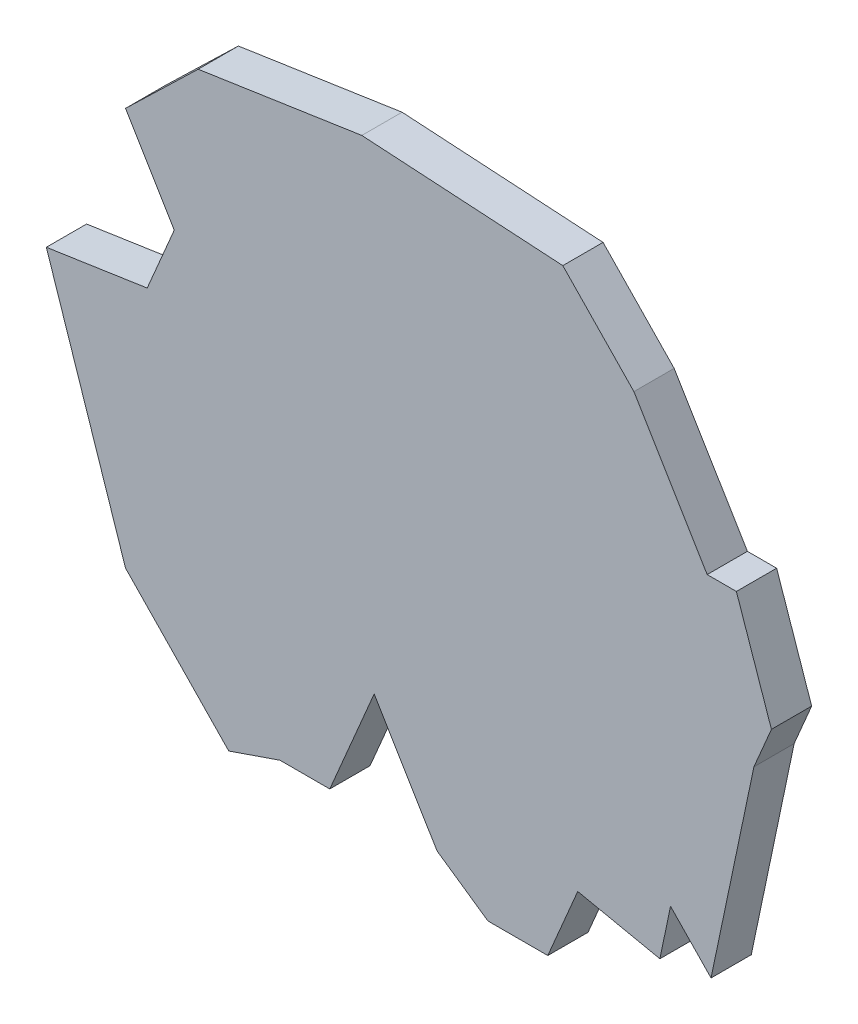
ISO-10303-21;
HEADER;
FILE_DESCRIPTION(('STEP AP214'),'2;1');
FILE_NAME('part.step','',(''),(''),'','','');
FILE_SCHEMA(('AUTOMOTIVE_DESIGN { 1 0 10303 214 1 1 1 1 }'));
ENDSEC;
DATA;
#1=APPLICATION_CONTEXT('core data for automotive mechanical design processes');
#2=APPLICATION_PROTOCOL_DEFINITION('international standard','automotive_design',2000,#1);
#3=PRODUCT_CONTEXT('',#1,'mechanical');
#4=PRODUCT('Part','Part','',(#3));
#5=PRODUCT_RELATED_PRODUCT_CATEGORY('part','',(#4));
#6=PRODUCT_DEFINITION_FORMATION('','',#4);
#7=PRODUCT_DEFINITION_CONTEXT('part definition',#1,'design');
#8=PRODUCT_DEFINITION('design','',#6,#7);
#9=PRODUCT_DEFINITION_SHAPE('','',#8);
#10=(LENGTH_UNIT() NAMED_UNIT(*) SI_UNIT(.MILLI.,.METRE.));
#11=(NAMED_UNIT(*) PLANE_ANGLE_UNIT() SI_UNIT($,.RADIAN.));
#12=(NAMED_UNIT(*) SI_UNIT($,.STERADIAN.) SOLID_ANGLE_UNIT());
#13=UNCERTAINTY_MEASURE_WITH_UNIT(LENGTH_MEASURE(1.E-05),#10,'distance_accuracy_value','');
#14=(GEOMETRIC_REPRESENTATION_CONTEXT(3) GLOBAL_UNCERTAINTY_ASSIGNED_CONTEXT((#13)) GLOBAL_UNIT_ASSIGNED_CONTEXT((#10,
#11,#12)) REPRESENTATION_CONTEXT('',''));
#15=CARTESIAN_POINT('',(0.,0.,0.));
#16=DIRECTION('',(0.,0.,1.));
#17=DIRECTION('',(1.,0.,0.));
#18=AXIS2_PLACEMENT_3D('',#15,#16,#17);
#19=CARTESIAN_POINT('',(-58.6586765581864,-85.7596664690475,10.));
#20=DIRECTION('',(-0.719010466921313,-0.694999243494261,0.));
#21=DIRECTION('',(0.694999243494261,-0.719010466921313,0.));
#22=AXIS2_PLACEMENT_3D('',#19,#20,#21);
#23=PLANE('',#22);
#24=DIRECTION('',(-0.694999243494261,0.719010466921313,0.));
#25=VECTOR('',#24,1.);
#26=CARTESIAN_POINT('',(-58.6586765581864,-85.7596664690475,0.));
#27=LINE('',#26,#25);
#28=CARTESIAN_POINT('',(-58.6586765581864,-85.7596664690475,0.));
#29=VERTEX_POINT('',#28);
#30=CARTESIAN_POINT('',(-84.3143066484571,-59.2176712898566,0.));
#31=VERTEX_POINT('',#30);
#32=EDGE_CURVE('E230',#29,#31,#27,.T.);
#33=ORIENTED_EDGE('',*,*,#32,.F.);
#34=DIRECTION('',(0.,0.,-1.));
#35=VECTOR('',#34,1.);
#36=CARTESIAN_POINT('',(-58.6586765581864,-85.7596664690475,10.));
#37=LINE('',#36,#35);
#38=CARTESIAN_POINT('',(-58.6586765581864,-85.7596664690475,10.));
#39=VERTEX_POINT('',#38);
#40=EDGE_CURVE('E11',#39,#29,#37,.T.);
#41=ORIENTED_EDGE('',*,*,#40,.F.);
#42=DIRECTION('',(-0.694999243494261,0.719010466921313,0.));
#43=VECTOR('',#42,1.);
#44=CARTESIAN_POINT('',(-58.6586765581864,-85.7596664690475,10.));
#45=LINE('',#44,#43);
#46=CARTESIAN_POINT('',(-84.3143066484571,-59.2176712898566,10.));
#47=VERTEX_POINT('',#46);
#48=EDGE_CURVE('E298',#39,#47,#45,.T.);
#49=ORIENTED_EDGE('',*,*,#48,.T.);
#50=DIRECTION('',(0.,0.,-1.));
#51=VECTOR('',#50,1.);
#52=CARTESIAN_POINT('',(-84.3143066484571,-59.2176712898566,10.));
#53=LINE('',#52,#51);
#54=EDGE_CURVE('E40',#47,#31,#53,.T.);
#55=ORIENTED_EDGE('',*,*,#54,.T.);
#56=EDGE_LOOP('',(#33,#41,#49,#55));
#57=FACE_BOUND('',#56,.T.);
#58=ADVANCED_FACE('F37',(#57),#23,.T.);
#59=CARTESIAN_POINT('',(-45.9200094828388,-81.3807496618967,10.));
#60=DIRECTION('',(0.325079768511046,-0.945686599304867,0.));
#61=DIRECTION('',(0.945686599304867,0.325079768511046,0.));
#62=AXIS2_PLACEMENT_3D('',#59,#60,#61);
#63=PLANE('',#62);
#64=DIRECTION('',(-0.945686599304867,-0.325079768511046,0.));
#65=VECTOR('',#64,1.);
#66=CARTESIAN_POINT('',(-45.9200094828388,-81.3807496618967,0.));
#67=LINE('',#66,#65);
#68=CARTESIAN_POINT('',(-45.9200094828388,-81.3807496618967,0.));
#69=VERTEX_POINT('',#68);
#70=EDGE_CURVE('E296',#69,#29,#67,.T.);
#71=ORIENTED_EDGE('',*,*,#70,.F.);
#72=DIRECTION('',(0.,0.,-1.));
#73=VECTOR('',#72,1.);
#74=CARTESIAN_POINT('',(-45.9200094828388,-81.3807496618967,10.));
#75=LINE('',#74,#73);
#76=CARTESIAN_POINT('',(-45.9200094828388,-81.3807496618967,10.));
#77=VERTEX_POINT('',#76);
#78=EDGE_CURVE('E46',#77,#69,#75,.T.);
#79=ORIENTED_EDGE('',*,*,#78,.F.);
#80=DIRECTION('',(-0.945686599304867,-0.325079768511046,0.));
#81=VECTOR('',#80,1.);
#82=CARTESIAN_POINT('',(-45.9200094828388,-81.3807496618967,10.));
#83=LINE('',#82,#81);
#84=EDGE_CURVE('E220',#77,#39,#83,.T.);
#85=ORIENTED_EDGE('',*,*,#84,.T.);
#86=ORIENTED_EDGE('',*,*,#40,.T.);
#87=EDGE_LOOP('',(#71,#79,#85,#86));
#88=FACE_BOUND('',#87,.T.);
#89=ADVANCED_FACE('F343',(#88),#63,.T.);
#90=CARTESIAN_POINT('',(-33.5495131369272,-81.3807496618967,10.));
#91=DIRECTION('',(0.,-1.,0.));
#92=DIRECTION('',(0.,0.,-1.));
#93=AXIS2_PLACEMENT_3D('',#90,#91,#92);
#94=PLANE('',#93);
#95=DIRECTION('',(-1.,0.,0.));
#96=VECTOR('',#95,1.);
#97=CARTESIAN_POINT('',(-33.5495131369272,-81.3807496618967,0.));
#98=LINE('',#97,#96);
#99=CARTESIAN_POINT('',(-33.5495131369272,-81.3807496618967,0.));
#100=VERTEX_POINT('',#99);
#101=EDGE_CURVE('E207',#100,#69,#98,.T.);
#102=ORIENTED_EDGE('',*,*,#101,.F.);
#103=DIRECTION('',(0.,0.,-1.));
#104=VECTOR('',#103,1.);
#105=CARTESIAN_POINT('',(-33.5495131369272,-81.3807496618967,10.));
#106=LINE('',#105,#104);
#107=CARTESIAN_POINT('',(-33.5495131369272,-81.3807496618967,10.));
#108=VERTEX_POINT('',#107);
#109=EDGE_CURVE('E202',#108,#100,#106,.T.);
#110=ORIENTED_EDGE('',*,*,#109,.F.);
#111=DIRECTION('',(-1.,0.,0.));
#112=VECTOR('',#111,1.);
#113=CARTESIAN_POINT('',(-33.5495131369272,-81.3807496618967,10.));
#114=LINE('',#113,#112);
#115=EDGE_CURVE('E205',#108,#77,#114,.T.);
#116=ORIENTED_EDGE('',*,*,#115,.T.);
#117=ORIENTED_EDGE('',*,*,#78,.T.);
#118=EDGE_LOOP('',(#102,#110,#116,#117));
#119=FACE_BOUND('',#118,.T.);
#120=ADVANCED_FACE('F204',(#119),#94,.T.);
#121=CARTESIAN_POINT('',(-22.5126465537247,-55.4116518190673,10.));
#122=DIRECTION('',(0.920330918458475,-0.391140640344852,0.));
#123=DIRECTION('',(0.391140640344852,0.920330918458475,0.));
#124=AXIS2_PLACEMENT_3D('',#121,#122,#123);
#125=PLANE('',#124);
#126=DIRECTION('',(-0.391140640344852,-0.920330918458474,0.));
#127=VECTOR('',#126,1.);
#128=CARTESIAN_POINT('',(-22.5126465537247,-55.4116518190673,0.));
#129=LINE('',#128,#127);
#130=CARTESIAN_POINT('',(-22.5126465537247,-55.4116518190673,0.));
#131=VERTEX_POINT('',#130);
#132=EDGE_CURVE('E293',#131,#100,#129,.T.);
#133=ORIENTED_EDGE('',*,*,#132,.F.);
#134=DIRECTION('',(0.,0.,-1.));
#135=VECTOR('',#134,1.);
#136=CARTESIAN_POINT('',(-22.5126465537247,-55.4116518190673,10.));
#137=LINE('',#136,#135);
#138=CARTESIAN_POINT('',(-22.5126465537247,-55.4116518190673,10.));
#139=VERTEX_POINT('',#138);
#140=EDGE_CURVE('E212',#139,#131,#137,.T.);
#141=ORIENTED_EDGE('',*,*,#140,.F.);
#142=DIRECTION('',(-0.391140640344852,-0.920330918458474,0.));
#143=VECTOR('',#142,1.);
#144=CARTESIAN_POINT('',(-22.5126465537247,-55.4116518190673,10.));
#145=LINE('',#144,#143);
#146=EDGE_CURVE('E218',#139,#108,#145,.T.);
#147=ORIENTED_EDGE('',*,*,#146,.T.);
#148=ORIENTED_EDGE('',*,*,#109,.T.);
#149=EDGE_LOOP('',(#133,#141,#147,#148));
#150=FACE_BOUND('',#149,.T.);
#151=ADVANCED_FACE('F222',(#150),#125,.T.);
#152=CARTESIAN_POINT('',(-6.89506135477158,-81.3807496618967,10.));
#153=DIRECTION('',(-0.856966526830987,-0.51537207131473,0.));
#154=DIRECTION('',(0.51537207131473,-0.856966526830987,0.));
#155=AXIS2_PLACEMENT_3D('',#152,#153,#154);
#156=PLANE('',#155);
#157=DIRECTION('',(-0.51537207131473,0.856966526830987,0.));
#158=VECTOR('',#157,1.);
#159=CARTESIAN_POINT('',(-6.89506135477158,-81.3807496618967,0.));
#160=LINE('',#159,#158);
#161=CARTESIAN_POINT('',(-6.89506135477158,-81.3807496618967,0.));
#162=VERTEX_POINT('',#161);
#163=EDGE_CURVE('E290',#162,#131,#160,.T.);
#164=ORIENTED_EDGE('',*,*,#163,.F.);
#165=DIRECTION('',(0.,0.,-1.));
#166=VECTOR('',#165,1.);
#167=CARTESIAN_POINT('',(-6.89506135477158,-81.3807496618967,10.));
#168=LINE('',#167,#166);
#169=CARTESIAN_POINT('',(-6.89506135477158,-81.3807496618967,10.));
#170=VERTEX_POINT('',#169);
#171=EDGE_CURVE('E302',#170,#162,#168,.T.);
#172=ORIENTED_EDGE('',*,*,#171,.F.);
#173=DIRECTION('',(-0.51537207131473,0.856966526830987,0.));
#174=VECTOR('',#173,1.);
#175=CARTESIAN_POINT('',(-6.89506135477158,-81.3807496618967,10.));
#176=LINE('',#175,#174);
#177=EDGE_CURVE('E223',#170,#139,#176,.T.);
#178=ORIENTED_EDGE('',*,*,#177,.T.);
#179=ORIENTED_EDGE('',*,*,#140,.T.);
#180=EDGE_LOOP('',(#164,#172,#178,#179));
#181=FACE_BOUND('',#180,.T.);
#182=ADVANCED_FACE('F356',(#181),#156,.T.);
#183=CARTESIAN_POINT('',(5.76965974475263,-90.1385832761982,10.));
#184=DIRECTION('',(-0.568768670552029,-0.822497537624568,0.));
#185=DIRECTION('',(0.822497537624568,-0.568768670552029,0.));
#186=AXIS2_PLACEMENT_3D('',#183,#184,#185);
#187=PLANE('',#186);
#188=DIRECTION('',(-0.822497537624568,0.568768670552029,0.));
#189=VECTOR('',#188,1.);
#190=CARTESIAN_POINT('',(5.76965974475263,-90.1385832761982,0.));
#191=LINE('',#190,#189);
#192=CARTESIAN_POINT('',(5.76965974475263,-90.1385832761982,0.));
#193=VERTEX_POINT('',#192);
#194=EDGE_CURVE('E287',#193,#162,#191,.T.);
#195=ORIENTED_EDGE('',*,*,#194,.F.);
#196=DIRECTION('',(0.,0.,-1.));
#197=VECTOR('',#196,1.);
#198=CARTESIAN_POINT('',(5.76965974475263,-90.1385832761982,10.));
#199=LINE('',#198,#197);
#200=CARTESIAN_POINT('',(5.76965974475263,-90.1385832761982,10.));
#201=VERTEX_POINT('',#200);
#202=EDGE_CURVE('E304',#201,#193,#199,.T.);
#203=ORIENTED_EDGE('',*,*,#202,.F.);
#204=DIRECTION('',(-0.822497537624568,0.568768670552029,0.));
#205=VECTOR('',#204,1.);
#206=CARTESIAN_POINT('',(5.76965974475263,-90.1385832761982,10.));
#207=LINE('',#206,#205);
#208=EDGE_CURVE('E225',#201,#170,#207,.T.);
#209=ORIENTED_EDGE('',*,*,#208,.T.);
#210=ORIENTED_EDGE('',*,*,#171,.T.);
#211=EDGE_LOOP('',(#195,#203,#209,#210));
#212=FACE_BOUND('',#211,.T.);
#213=ADVANCED_FACE('F359',(#212),#187,.T.);
#214=CARTESIAN_POINT('',(20.6367531750056,-90.1385832761982,10.));
#215=DIRECTION('',(0.,-1.,0.));
#216=DIRECTION('',(0.,0.,-1.));
#217=AXIS2_PLACEMENT_3D('',#214,#215,#216);
#218=PLANE('',#217);
#219=DIRECTION('',(-1.,0.,0.));
#220=VECTOR('',#219,1.);
#221=CARTESIAN_POINT('',(20.6367531750056,-90.1385832761982,0.));
#222=LINE('',#221,#220);
#223=CARTESIAN_POINT('',(20.6367531750056,-90.1385832761982,0.));
#224=VERTEX_POINT('',#223);
#225=EDGE_CURVE('E284',#224,#193,#222,.T.);
#226=ORIENTED_EDGE('',*,*,#225,.F.);
#227=DIRECTION('',(0.,0.,-1.));
#228=VECTOR('',#227,1.);
#229=CARTESIAN_POINT('',(20.6367531750056,-90.1385832761982,10.));
#230=LINE('',#229,#228);
#231=CARTESIAN_POINT('',(20.6367531750056,-90.1385832761982,10.));
#232=VERTEX_POINT('',#231);
#233=EDGE_CURVE('E306',#232,#224,#230,.T.);
#234=ORIENTED_EDGE('',*,*,#233,.F.);
#235=DIRECTION('',(-1.,0.,0.));
#236=VECTOR('',#235,1.);
#237=CARTESIAN_POINT('',(20.6367531750056,-90.1385832761982,10.));
#238=LINE('',#237,#236);
#239=EDGE_CURVE('E656',#232,#201,#238,.T.);
#240=ORIENTED_EDGE('',*,*,#239,.T.);
#241=ORIENTED_EDGE('',*,*,#202,.T.);
#242=EDGE_LOOP('',(#226,#234,#240,#241));
#243=FACE_BOUND('',#242,.T.);
#244=ADVANCED_FACE('F363',(#243),#218,.T.);
#245=CARTESIAN_POINT('',(28.0809117471618,-72.6229160475953,10.));
#246=DIRECTION('',(0.920330918458475,-0.391140640344852,0.));
#247=DIRECTION('',(0.391140640344852,0.920330918458475,0.));
#248=AXIS2_PLACEMENT_3D('',#245,#246,#247);
#249=PLANE('',#248);
#250=DIRECTION('',(-0.391140640344852,-0.920330918458475,0.));
#251=VECTOR('',#250,1.);
#252=CARTESIAN_POINT('',(28.0809117471618,-72.6229160475953,0.));
#253=LINE('',#252,#251);
#254=CARTESIAN_POINT('',(28.0809117471618,-72.6229160475953,0.));
#255=VERTEX_POINT('',#254);
#256=EDGE_CURVE('E281',#255,#224,#253,.T.);
#257=ORIENTED_EDGE('',*,*,#256,.F.);
#258=DIRECTION('',(0.,0.,-1.));
#259=VECTOR('',#258,1.);
#260=CARTESIAN_POINT('',(28.0809117471618,-72.6229160475953,10.));
#261=LINE('',#260,#259);
#262=CARTESIAN_POINT('',(28.0809117471618,-72.6229160475953,10.));
#263=VERTEX_POINT('',#262);
#264=EDGE_CURVE('E308',#263,#255,#261,.T.);
#265=ORIENTED_EDGE('',*,*,#264,.F.);
#266=DIRECTION('',(-0.391140640344852,-0.920330918458475,0.));
#267=VECTOR('',#266,1.);
#268=CARTESIAN_POINT('',(28.0809117471618,-72.6229160475953,10.));
#269=LINE('',#268,#267);
#270=EDGE_CURVE('E653',#263,#232,#269,.T.);
#271=ORIENTED_EDGE('',*,*,#270,.T.);
#272=ORIENTED_EDGE('',*,*,#233,.T.);
#273=EDGE_LOOP('',(#257,#265,#271,#272));
#274=FACE_BOUND('',#273,.T.);
#275=ADVANCED_FACE('F367',(#274),#249,.T.);
#276=CARTESIAN_POINT('',(48.493055515135,-76.906862890073,10.));
#277=DIRECTION('',(-0.205397684912949,-0.978678594346684,0.));
#278=DIRECTION('',(0.978678594346684,-0.205397684912949,0.));
#279=AXIS2_PLACEMENT_3D('',#276,#277,#278);
#280=PLANE('',#279);
#281=DIRECTION('',(-0.978678594346684,0.205397684912949,0.));
#282=VECTOR('',#281,1.);
#283=CARTESIAN_POINT('',(48.493055515135,-76.906862890073,0.));
#284=LINE('',#283,#282);
#285=CARTESIAN_POINT('',(48.493055515135,-76.906862890073,0.));
#286=VERTEX_POINT('',#285);
#287=EDGE_CURVE('E278',#286,#255,#284,.T.);
#288=ORIENTED_EDGE('',*,*,#287,.F.);
#289=DIRECTION('',(0.,0.,-1.));
#290=VECTOR('',#289,1.);
#291=CARTESIAN_POINT('',(48.493055515135,-76.906862890073,10.));
#292=LINE('',#291,#290);
#293=CARTESIAN_POINT('',(48.493055515135,-76.906862890073,10.));
#294=VERTEX_POINT('',#293);
#295=EDGE_CURVE('E310',#294,#286,#292,.T.);
#296=ORIENTED_EDGE('',*,*,#295,.F.);
#297=DIRECTION('',(-0.978678594346684,0.205397684912949,0.));
#298=VECTOR('',#297,1.);
#299=CARTESIAN_POINT('',(48.493055515135,-76.906862890073,10.));
#300=LINE('',#299,#298);
#301=EDGE_CURVE('E650',#294,#263,#300,.T.);
#302=ORIENTED_EDGE('',*,*,#301,.T.);
#303=ORIENTED_EDGE('',*,*,#264,.T.);
#304=EDGE_LOOP('',(#288,#296,#302,#303));
#305=FACE_BOUND('',#304,.T.);
#306=ADVANCED_FACE('F371',(#305),#280,.T.);
#307=CARTESIAN_POINT('',(51.1437110514568,-64.2770231940505,10.));
#308=DIRECTION('',(0.978678594346684,-0.205397684912949,0.));
#309=DIRECTION('',(0.205397684912949,0.978678594346684,0.));
#310=AXIS2_PLACEMENT_3D('',#307,#308,#309);
#311=PLANE('',#310);
#312=DIRECTION('',(-0.205397684912949,-0.978678594346684,0.));
#313=VECTOR('',#312,1.);
#314=CARTESIAN_POINT('',(51.1437110514568,-64.2770231940505,0.));
#315=LINE('',#314,#313);
#316=CARTESIAN_POINT('',(51.1437110514568,-64.2770231940505,0.));
#317=VERTEX_POINT('',#316);
#318=EDGE_CURVE('E275',#317,#286,#315,.T.);
#319=ORIENTED_EDGE('',*,*,#318,.F.);
#320=DIRECTION('',(0.,0.,-1.));
#321=VECTOR('',#320,1.);
#322=CARTESIAN_POINT('',(51.1437110514568,-64.2770231940505,10.));
#323=LINE('',#322,#321);
#324=CARTESIAN_POINT('',(51.1437110514568,-64.2770231940505,10.));
#325=VERTEX_POINT('',#324);
#326=EDGE_CURVE('E312',#325,#317,#323,.T.);
#327=ORIENTED_EDGE('',*,*,#326,.F.);
#328=DIRECTION('',(-0.205397684912949,-0.978678594346684,0.));
#329=VECTOR('',#328,1.);
#330=CARTESIAN_POINT('',(51.1437110514568,-64.2770231940505,10.));
#331=LINE('',#330,#329);
#332=EDGE_CURVE('E642',#325,#294,#331,.T.);
#333=ORIENTED_EDGE('',*,*,#332,.T.);
#334=ORIENTED_EDGE('',*,*,#295,.T.);
#335=EDGE_LOOP('',(#319,#327,#333,#334));
#336=FACE_BOUND('',#335,.T.);
#337=ADVANCED_FACE('F375',(#336),#311,.T.);
#338=CARTESIAN_POINT('',(61.2056089479091,-74.686545178951,10.));
#339=DIRECTION('',(-0.719010466921313,-0.694999243494261,0.));
#340=DIRECTION('',(0.694999243494261,-0.719010466921313,0.));
#341=AXIS2_PLACEMENT_3D('',#338,#339,#340);
#342=PLANE('',#341);
#343=DIRECTION('',(-0.694999243494261,0.719010466921313,0.));
#344=VECTOR('',#343,1.);
#345=CARTESIAN_POINT('',(61.2056089479091,-74.686545178951,0.));
#346=LINE('',#345,#344);
#347=CARTESIAN_POINT('',(61.2056089479091,-74.686545178951,0.));
#348=VERTEX_POINT('',#347);
#349=EDGE_CURVE('E272',#348,#317,#346,.T.);
#350=ORIENTED_EDGE('',*,*,#349,.F.);
#351=DIRECTION('',(0.,0.,-1.));
#352=VECTOR('',#351,1.);
#353=CARTESIAN_POINT('',(61.2056089479091,-74.686545178951,10.));
#354=LINE('',#353,#352);
#355=CARTESIAN_POINT('',(61.2056089479091,-74.686545178951,10.));
#356=VERTEX_POINT('',#355);
#357=EDGE_CURVE('E314',#356,#348,#354,.T.);
#358=ORIENTED_EDGE('',*,*,#357,.F.);
#359=DIRECTION('',(-0.694999243494261,0.719010466921313,0.));
#360=VECTOR('',#359,1.);
#361=CARTESIAN_POINT('',(61.2056089479091,-74.686545178951,10.));
#362=LINE('',#361,#360);
#363=EDGE_CURVE('E640',#356,#325,#362,.T.);
#364=ORIENTED_EDGE('',*,*,#363,.T.);
#365=ORIENTED_EDGE('',*,*,#326,.T.);
#366=EDGE_LOOP('',(#350,#358,#364,#365));
#367=FACE_BOUND('',#366,.T.);
#368=ADVANCED_FACE('F379',(#367),#342,.T.);
#369=CARTESIAN_POINT('',(63.879972464705,-61.9437417315845,10.));
#370=DIRECTION('',(0.978678594346684,-0.205397684912949,0.));
#371=DIRECTION('',(0.205397684912949,0.978678594346684,0.));
#372=AXIS2_PLACEMENT_3D('',#369,#370,#371);
#373=PLANE('',#372);
#374=DIRECTION('',(-0.205397684912949,-0.978678594346684,0.));
#375=VECTOR('',#374,1.);
#376=CARTESIAN_POINT('',(63.879972464705,-61.9437417315845,0.));
#377=LINE('',#376,#375);
#378=CARTESIAN_POINT('',(71.8636729828945,-23.9030169583812,0.));
#379=VERTEX_POINT('',#378);
#380=EDGE_CURVE('E269',#379,#348,#377,.T.);
#381=ORIENTED_EDGE('',*,*,#380,.F.);
#382=DIRECTION('',(0.,0.,-1.));
#383=VECTOR('',#382,1.);
#384=CARTESIAN_POINT('',(71.8636729828945,-23.9030169583812,10.));
#385=LINE('',#384,#383);
#386=CARTESIAN_POINT('',(71.8636729828945,-23.9030169583812,10.));
#387=VERTEX_POINT('',#386);
#388=EDGE_CURVE('E316',#387,#379,#385,.T.);
#389=ORIENTED_EDGE('',*,*,#388,.F.);
#390=DIRECTION('',(-0.205397684912949,-0.978678594346684,0.));
#391=VECTOR('',#390,1.);
#392=CARTESIAN_POINT('',(71.8636729828945,-23.9030169583812,10.));
#393=LINE('',#392,#391);
#394=EDGE_CURVE('E635',#387,#356,#393,.T.);
#395=ORIENTED_EDGE('',*,*,#394,.T.);
#396=ORIENTED_EDGE('',*,*,#357,.T.);
#397=EDGE_LOOP('',(#381,#389,#395,#396));
#398=FACE_BOUND('',#397,.T.);
#399=ADVANCED_FACE('F383',(#398),#373,.T.);
#400=CARTESIAN_POINT('',(76.2171708608559,-13.6594925396485,10.));
#401=DIRECTION('',(0.920330918458475,-0.391140640344852,0.));
#402=DIRECTION('',(0.391140640344852,0.920330918458475,0.));
#403=AXIS2_PLACEMENT_3D('',#400,#401,#402);
#404=PLANE('',#403);
#405=DIRECTION('',(-0.391140640344852,-0.920330918458475,0.));
#406=VECTOR('',#405,1.);
#407=CARTESIAN_POINT('',(76.2171708608559,-13.6594925396485,0.));
#408=LINE('',#407,#406);
#409=CARTESIAN_POINT('',(76.2171708608559,-13.6594925396485,0.));
#410=VERTEX_POINT('',#409);
#411=EDGE_CURVE('E266',#410,#379,#408,.T.);
#412=ORIENTED_EDGE('',*,*,#411,.F.);
#413=DIRECTION('',(0.,0.,-1.));
#414=VECTOR('',#413,1.);
#415=CARTESIAN_POINT('',(76.2171708608559,-13.6594925396485,10.));
#416=LINE('',#415,#414);
#417=CARTESIAN_POINT('',(76.2171708608559,-13.6594925396485,10.));
#418=VERTEX_POINT('',#417);
#419=EDGE_CURVE('E319',#418,#410,#416,.T.);
#420=ORIENTED_EDGE('',*,*,#419,.F.);
#421=DIRECTION('',(-0.391140640344852,-0.920330918458475,0.));
#422=VECTOR('',#421,1.);
#423=CARTESIAN_POINT('',(76.2171708608559,-13.6594925396485,10.));
#424=LINE('',#423,#422);
#425=EDGE_CURVE('E633',#418,#387,#424,.T.);
#426=ORIENTED_EDGE('',*,*,#425,.T.);
#427=ORIENTED_EDGE('',*,*,#388,.T.);
#428=EDGE_LOOP('',(#412,#420,#426,#427));
#429=FACE_BOUND('',#428,.T.);
#430=ADVANCED_FACE('F387',(#429),#404,.T.);
#431=CARTESIAN_POINT('',(67.5101751049331,11.6699496593999,10.));
#432=DIRECTION('',(0.945686599304867,0.325079768511046,0.));
#433=DIRECTION('',(-0.325079768511046,0.945686599304868,0.));
#434=AXIS2_PLACEMENT_3D('',#431,#432,#433);
#435=PLANE('',#434);
#436=DIRECTION('',(0.325079768511046,-0.945686599304867,0.));
#437=VECTOR('',#436,1.);
#438=CARTESIAN_POINT('',(67.5101751049331,11.6699496593999,0.));
#439=LINE('',#438,#437);
#440=CARTESIAN_POINT('',(67.5101751049331,11.6699496593999,0.));
#441=VERTEX_POINT('',#440);
#442=EDGE_CURVE('E263',#441,#410,#439,.T.);
#443=ORIENTED_EDGE('',*,*,#442,.F.);
#444=DIRECTION('',(0.,0.,-1.));
#445=VECTOR('',#444,1.);
#446=CARTESIAN_POINT('',(67.5101751049331,11.6699496593999,10.));
#447=LINE('',#446,#445);
#448=CARTESIAN_POINT('',(67.5101751049331,11.6699496593999,10.));
#449=VERTEX_POINT('',#448);
#450=EDGE_CURVE('E321',#449,#441,#447,.T.);
#451=ORIENTED_EDGE('',*,*,#450,.F.);
#452=DIRECTION('',(0.325079768511046,-0.945686599304867,0.));
#453=VECTOR('',#452,1.);
#454=CARTESIAN_POINT('',(67.5101751049331,11.6699496593999,10.));
#455=LINE('',#454,#453);
#456=EDGE_CURVE('E644',#449,#418,#455,.T.);
#457=ORIENTED_EDGE('',*,*,#456,.T.);
#458=ORIENTED_EDGE('',*,*,#419,.T.);
#459=EDGE_LOOP('',(#443,#451,#457,#458));
#460=FACE_BOUND('',#459,.T.);
#461=ADVANCED_FACE('F391',(#460),#435,.T.);
#462=CARTESIAN_POINT('',(60.2497698244769,11.6699496593999,10.));
#463=DIRECTION('',(0.,1.,0.));
#464=DIRECTION('',(0.,0.,1.));
#465=AXIS2_PLACEMENT_3D('',#462,#463,#464);
#466=PLANE('',#465);
#467=DIRECTION('',(1.,0.,0.));
#468=VECTOR('',#467,1.);
#469=CARTESIAN_POINT('',(60.2497698244769,11.6699496593999,0.));
#470=LINE('',#469,#468);
#471=CARTESIAN_POINT('',(60.2497698244769,11.6699496593999,0.));
#472=VERTEX_POINT('',#471);
#473=EDGE_CURVE('E260',#472,#441,#470,.T.);
#474=ORIENTED_EDGE('',*,*,#473,.F.);
#475=DIRECTION('',(0.,0.,-1.));
#476=VECTOR('',#475,1.);
#477=CARTESIAN_POINT('',(60.2497698244769,11.6699496593999,10.));
#478=LINE('',#477,#476);
#479=CARTESIAN_POINT('',(60.2497698244769,11.6699496593999,10.));
#480=VERTEX_POINT('',#479);
#481=EDGE_CURVE('E323',#480,#472,#478,.T.);
#482=ORIENTED_EDGE('',*,*,#481,.F.);
#483=DIRECTION('',(1.,0.,0.));
#484=VECTOR('',#483,1.);
#485=CARTESIAN_POINT('',(60.2497698244769,11.6699496593999,10.));
#486=LINE('',#485,#484);
#487=EDGE_CURVE('E627',#480,#449,#486,.T.);
#488=ORIENTED_EDGE('',*,*,#487,.T.);
#489=ORIENTED_EDGE('',*,*,#450,.T.);
#490=EDGE_LOOP('',(#474,#482,#488,#489));
#491=FACE_BOUND('',#490,.T.);
#492=ADVANCED_FACE('F395',(#491),#466,.T.);
#493=CARTESIAN_POINT('',(42.0376522784368,41.9532653226901,10.));
#494=DIRECTION('',(0.856966526830987,0.51537207131473,0.));
#495=DIRECTION('',(-0.51537207131473,0.856966526830987,0.));
#496=AXIS2_PLACEMENT_3D('',#493,#494,#495);
#497=PLANE('',#496);
#498=DIRECTION('',(0.51537207131473,-0.856966526830987,0.));
#499=VECTOR('',#498,1.);
#500=CARTESIAN_POINT('',(42.0376522784368,41.9532653226901,0.));
#501=LINE('',#500,#499);
#502=CARTESIAN_POINT('',(42.0376522784368,41.9532653226901,0.));
#503=VERTEX_POINT('',#502);
#504=EDGE_CURVE('E257',#503,#472,#501,.T.);
#505=ORIENTED_EDGE('',*,*,#504,.F.);
#506=DIRECTION('',(0.,0.,-1.));
#507=VECTOR('',#506,1.);
#508=CARTESIAN_POINT('',(42.0376522784368,41.9532653226901,10.));
#509=LINE('',#508,#507);
#510=CARTESIAN_POINT('',(42.0376522784368,41.9532653226901,10.));
#511=VERTEX_POINT('',#510);
#512=EDGE_CURVE('E325',#511,#503,#509,.T.);
#513=ORIENTED_EDGE('',*,*,#512,.F.);
#514=DIRECTION('',(0.51537207131473,-0.856966526830987,0.));
#515=VECTOR('',#514,1.);
#516=CARTESIAN_POINT('',(42.0376522784368,41.9532653226901,10.));
#517=LINE('',#516,#515);
#518=EDGE_CURVE('E623',#511,#480,#517,.T.);
#519=ORIENTED_EDGE('',*,*,#518,.T.);
#520=ORIENTED_EDGE('',*,*,#481,.T.);
#521=EDGE_LOOP('',(#505,#513,#519,#520));
#522=FACE_BOUND('',#521,.T.);
#523=ADVANCED_FACE('F399',(#522),#497,.T.);
#524=CARTESIAN_POINT('',(24.3709688596788,60.2303072227754,10.));
#525=DIRECTION('',(0.719010466921313,0.694999243494261,0.));
#526=DIRECTION('',(-0.694999243494261,0.719010466921313,0.));
#527=AXIS2_PLACEMENT_3D('',#524,#525,#526);
#528=PLANE('',#527);
#529=DIRECTION('',(0.694999243494261,-0.719010466921313,0.));
#530=VECTOR('',#529,1.);
#531=CARTESIAN_POINT('',(24.3709688596788,60.2303072227754,0.));
#532=LINE('',#531,#530);
#533=CARTESIAN_POINT('',(24.3709688596788,60.2303072227754,0.));
#534=VERTEX_POINT('',#533);
#535=EDGE_CURVE('E254',#534,#503,#532,.T.);
#536=ORIENTED_EDGE('',*,*,#535,.F.);
#537=DIRECTION('',(0.,0.,-1.));
#538=VECTOR('',#537,1.);
#539=CARTESIAN_POINT('',(24.3709688596788,60.2303072227754,10.));
#540=LINE('',#539,#538);
#541=CARTESIAN_POINT('',(24.3709688596788,60.2303072227754,10.));
#542=VERTEX_POINT('',#541);
#543=EDGE_CURVE('E327',#542,#534,#540,.T.);
#544=ORIENTED_EDGE('',*,*,#543,.F.);
#545=DIRECTION('',(0.694999243494261,-0.719010466921313,0.));
#546=VECTOR('',#545,1.);
#547=CARTESIAN_POINT('',(24.3709688596788,60.2303072227754,10.));
#548=LINE('',#547,#546);
#549=EDGE_CURVE('E673',#542,#511,#548,.T.);
#550=ORIENTED_EDGE('',*,*,#549,.T.);
#551=ORIENTED_EDGE('',*,*,#512,.T.);
#552=EDGE_LOOP('',(#536,#544,#550,#551));
#553=FACE_BOUND('',#552,.T.);
#554=ADVANCED_FACE('F403',(#553),#528,.T.);
#555=CARTESIAN_POINT('',(-25.5790774568863,63.2768233347358,10.));
#556=DIRECTION('',(0.060878130808929,0.998145206465077,0.));
#557=DIRECTION('',(-0.998145206465077,0.060878130808929,0.));
#558=AXIS2_PLACEMENT_3D('',#555,#556,#557);
#559=PLANE('',#558);
#560=DIRECTION('',(0.998145206465077,-0.060878130808929,0.));
#561=VECTOR('',#560,1.);
#562=CARTESIAN_POINT('',(-25.5790774568863,63.2768233347358,0.));
#563=LINE('',#562,#561);
#564=CARTESIAN_POINT('',(-25.5790774568863,63.2768233347358,0.));
#565=VERTEX_POINT('',#564);
#566=EDGE_CURVE('E251',#565,#534,#563,.T.);
#567=ORIENTED_EDGE('',*,*,#566,.F.);
#568=DIRECTION('',(0.,0.,-1.));
#569=VECTOR('',#568,1.);
#570=CARTESIAN_POINT('',(-25.5790774568863,63.2768233347358,10.));
#571=LINE('',#570,#569);
#572=CARTESIAN_POINT('',(-25.5790774568863,63.2768233347358,10.));
#573=VERTEX_POINT('',#572);
#574=EDGE_CURVE('E329',#573,#565,#571,.T.);
#575=ORIENTED_EDGE('',*,*,#574,.F.);
#576=DIRECTION('',(0.998145206465077,-0.060878130808929,0.));
#577=VECTOR('',#576,1.);
#578=CARTESIAN_POINT('',(-25.5790774568863,63.2768233347358,10.));
#579=LINE('',#578,#577);
#580=EDGE_CURVE('E616',#573,#542,#579,.T.);
#581=ORIENTED_EDGE('',*,*,#580,.T.);
#582=ORIENTED_EDGE('',*,*,#543,.T.);
#583=EDGE_LOOP('',(#567,#575,#581,#582));
#584=FACE_BOUND('',#583,.T.);
#585=ADVANCED_FACE('F407',(#584),#559,.T.);
#586=CARTESIAN_POINT('',(-66.2609415087912,57.183791110815,10.));
#587=DIRECTION('',(-0.148120593661365,0.988969306770137,0.));
#588=DIRECTION('',(-0.988969306770137,-0.148120593661365,0.));
#589=AXIS2_PLACEMENT_3D('',#586,#587,#588);
#590=PLANE('',#589);
#591=DIRECTION('',(0.988969306770137,0.148120593661365,0.));
#592=VECTOR('',#591,1.);
#593=CARTESIAN_POINT('',(-66.2609415087912,57.183791110815,0.));
#594=LINE('',#593,#592);
#595=CARTESIAN_POINT('',(-66.2609415087912,57.183791110815,0.));
#596=VERTEX_POINT('',#595);
#597=EDGE_CURVE('E248',#596,#565,#594,.T.);
#598=ORIENTED_EDGE('',*,*,#597,.F.);
#599=DIRECTION('',(0.,0.,-1.));
#600=VECTOR('',#599,1.);
#601=CARTESIAN_POINT('',(-66.2609415087912,57.183791110815,10.));
#602=LINE('',#601,#600);
#603=CARTESIAN_POINT('',(-66.2609415087912,57.183791110815,10.));
#604=VERTEX_POINT('',#603);
#605=EDGE_CURVE('E331',#604,#596,#602,.T.);
#606=ORIENTED_EDGE('',*,*,#605,.F.);
#607=DIRECTION('',(0.988969306770137,0.148120593661365,0.));
#608=VECTOR('',#607,1.);
#609=CARTESIAN_POINT('',(-66.2609415087912,57.183791110815,10.));
#610=LINE('',#609,#608);
#611=EDGE_CURVE('E612',#604,#573,#610,.T.);
#612=ORIENTED_EDGE('',*,*,#611,.T.);
#613=ORIENTED_EDGE('',*,*,#574,.T.);
#614=EDGE_LOOP('',(#598,#606,#612,#613));
#615=FACE_BOUND('',#614,.T.);
#616=ADVANCED_FACE('F411',(#615),#590,.T.);
#617=CARTESIAN_POINT('',(-84.3143066484571,39.733314807851,10.));
#618=DIRECTION('',(-0.694999243494261,0.719010466921313,0.));
#619=DIRECTION('',(-0.719010466921313,-0.694999243494261,0.));
#620=AXIS2_PLACEMENT_3D('',#617,#618,#619);
#621=PLANE('',#620);
#622=DIRECTION('',(0.719010466921313,0.694999243494261,0.));
#623=VECTOR('',#622,1.);
#624=CARTESIAN_POINT('',(-84.3143066484571,39.733314807851,0.));
#625=LINE('',#624,#623);
#626=CARTESIAN_POINT('',(-84.3143066484571,39.733314807851,0.));
#627=VERTEX_POINT('',#626);
#628=EDGE_CURVE('E245',#627,#596,#625,.T.);
#629=ORIENTED_EDGE('',*,*,#628,.F.);
#630=DIRECTION('',(0.,0.,-1.));
#631=VECTOR('',#630,1.);
#632=CARTESIAN_POINT('',(-84.3143066484571,39.733314807851,10.));
#633=LINE('',#632,#631);
#634=CARTESIAN_POINT('',(-84.3143066484571,39.733314807851,10.));
#635=VERTEX_POINT('',#634);
#636=EDGE_CURVE('E333',#635,#627,#633,.T.);
#637=ORIENTED_EDGE('',*,*,#636,.F.);
#638=DIRECTION('',(0.719010466921313,0.694999243494261,0.));
#639=VECTOR('',#638,1.);
#640=CARTESIAN_POINT('',(-84.3143066484571,39.733314807851,10.));
#641=LINE('',#640,#639);
#642=EDGE_CURVE('E677',#635,#604,#641,.T.);
#643=ORIENTED_EDGE('',*,*,#642,.T.);
#644=ORIENTED_EDGE('',*,*,#605,.T.);
#645=EDGE_LOOP('',(#629,#637,#643,#644));
#646=FACE_BOUND('',#645,.T.);
#647=ADVANCED_FACE('F415',(#646),#621,.T.);
#648=CARTESIAN_POINT('',(-72.1975295241932,19.5854003466026,10.));
#649=DIRECTION('',(-0.856966526830987,-0.51537207131473,0.));
#650=DIRECTION('',(0.51537207131473,-0.856966526830987,0.));
#651=AXIS2_PLACEMENT_3D('',#648,#649,#650);
#652=PLANE('',#651);
#653=DIRECTION('',(-0.51537207131473,0.856966526830987,0.));
#654=VECTOR('',#653,1.);
#655=CARTESIAN_POINT('',(-72.1975295241932,19.5854003466026,0.));
#656=LINE('',#655,#654);
#657=CARTESIAN_POINT('',(-72.1975295241932,19.5854003466026,0.));
#658=VERTEX_POINT('',#657);
#659=EDGE_CURVE('E242',#658,#627,#656,.T.);
#660=ORIENTED_EDGE('',*,*,#659,.F.);
#661=DIRECTION('',(0.,0.,-1.));
#662=VECTOR('',#661,1.);
#663=CARTESIAN_POINT('',(-72.1975295241932,19.5854003466026,10.));
#664=LINE('',#663,#662);
#665=CARTESIAN_POINT('',(-72.1975295241932,19.5854003466026,10.));
#666=VERTEX_POINT('',#665);
#667=EDGE_CURVE('E335',#666,#658,#664,.T.);
#668=ORIENTED_EDGE('',*,*,#667,.F.);
#669=DIRECTION('',(-0.51537207131473,0.856966526830987,0.));
#670=VECTOR('',#669,1.);
#671=CARTESIAN_POINT('',(-72.1975295241932,19.5854003466026,10.));
#672=LINE('',#671,#670);
#673=EDGE_CURVE('E605',#666,#635,#672,.T.);
#674=ORIENTED_EDGE('',*,*,#673,.T.);
#675=ORIENTED_EDGE('',*,*,#636,.T.);
#676=EDGE_LOOP('',(#660,#668,#674,#675));
#677=FACE_BOUND('',#676,.T.);
#678=ADVANCED_FACE('F419',(#677),#652,.T.);
#679=CARTESIAN_POINT('',(-78.9256626083154,3.75449897219732,10.));
#680=DIRECTION('',(-0.920330918458474,0.391140640344852,0.));
#681=DIRECTION('',(-0.391140640344852,-0.920330918458474,0.));
#682=AXIS2_PLACEMENT_3D('',#679,#680,#681);
#683=PLANE('',#682);
#684=DIRECTION('',(0.391140640344852,0.920330918458474,0.));
#685=VECTOR('',#684,1.);
#686=CARTESIAN_POINT('',(-78.9256626083154,3.75449897219732,0.));
#687=LINE('',#686,#685);
#688=CARTESIAN_POINT('',(-78.9256626083154,3.75449897219732,0.));
#689=VERTEX_POINT('',#688);
#690=EDGE_CURVE('E239',#689,#658,#687,.T.);
#691=ORIENTED_EDGE('',*,*,#690,.F.);
#692=DIRECTION('',(0.,0.,-1.));
#693=VECTOR('',#692,1.);
#694=CARTESIAN_POINT('',(-78.9256626083154,3.75449897219732,10.));
#695=LINE('',#694,#693);
#696=CARTESIAN_POINT('',(-78.9256626083154,3.75449897219732,10.));
#697=VERTEX_POINT('',#696);
#698=EDGE_CURVE('E337',#697,#689,#695,.T.);
#699=ORIENTED_EDGE('',*,*,#698,.F.);
#700=DIRECTION('',(0.391140640344852,0.920330918458474,0.));
#701=VECTOR('',#700,1.);
#702=CARTESIAN_POINT('',(-78.9256626083154,3.75449897219732,10.));
#703=LINE('',#702,#701);
#704=EDGE_CURVE('E601',#697,#666,#703,.T.);
#705=ORIENTED_EDGE('',*,*,#704,.T.);
#706=ORIENTED_EDGE('',*,*,#667,.T.);
#707=EDGE_LOOP('',(#691,#699,#705,#706));
#708=FACE_BOUND('',#707,.T.);
#709=ADVANCED_FACE('F423',(#708),#683,.T.);
#710=CARTESIAN_POINT('',(-103.99364373113,0.,10.));
#711=DIRECTION('',(-0.148120593661365,0.988969306770137,0.));
#712=DIRECTION('',(-0.988969306770137,-0.148120593661365,0.));
#713=AXIS2_PLACEMENT_3D('',#710,#711,#712);
#714=PLANE('',#713);
#715=DIRECTION('',(0.988969306770137,0.148120593661365,0.));
#716=VECTOR('',#715,1.);
#717=CARTESIAN_POINT('',(-103.99364373113,0.,0.));
#718=LINE('',#717,#716);
#719=CARTESIAN_POINT('',(-103.99364373113,0.,0.));
#720=VERTEX_POINT('',#719);
#721=EDGE_CURVE('E236',#720,#689,#718,.T.);
#722=ORIENTED_EDGE('',*,*,#721,.F.);
#723=DIRECTION('',(0.,0.,-1.));
#724=VECTOR('',#723,1.);
#725=CARTESIAN_POINT('',(-103.99364373113,0.,10.));
#726=LINE('',#725,#724);
#727=CARTESIAN_POINT('',(-103.99364373113,0.,10.));
#728=VERTEX_POINT('',#727);
#729=EDGE_CURVE('E338',#728,#720,#726,.T.);
#730=ORIENTED_EDGE('',*,*,#729,.F.);
#731=DIRECTION('',(0.988969306770137,0.148120593661365,0.));
#732=VECTOR('',#731,1.);
#733=CARTESIAN_POINT('',(-103.99364373113,0.,10.));
#734=LINE('',#733,#732);
#735=EDGE_CURVE('E681',#728,#697,#734,.T.);
#736=ORIENTED_EDGE('',*,*,#735,.T.);
#737=ORIENTED_EDGE('',*,*,#698,.T.);
#738=EDGE_LOOP('',(#722,#730,#736,#737));
#739=FACE_BOUND('',#738,.T.);
#740=ADVANCED_FACE('F427',(#739),#714,.T.);
#741=CARTESIAN_POINT('',(-84.3143066484571,-59.2176712898566,10.));
#742=DIRECTION('',(-0.948970812396995,-0.315363912359336,0.));
#743=DIRECTION('',(0.315363912359336,-0.948970812396995,0.));
#744=AXIS2_PLACEMENT_3D('',#741,#742,#743);
#745=PLANE('',#744);
#746=DIRECTION('',(-0.315363912359336,0.948970812396995,0.));
#747=VECTOR('',#746,1.);
#748=CARTESIAN_POINT('',(-84.3143066484571,-59.2176712898566,0.));
#749=LINE('',#748,#747);
#750=EDGE_CURVE('E233',#31,#720,#749,.T.);
#751=ORIENTED_EDGE('',*,*,#750,.F.);
#752=ORIENTED_EDGE('',*,*,#54,.F.);
#753=DIRECTION('',(-0.315363912359336,0.948970812396995,0.));
#754=VECTOR('',#753,1.);
#755=CARTESIAN_POINT('',(-84.3143066484571,-59.2176712898566,10.));
#756=LINE('',#755,#754);
#757=EDGE_CURVE('E683',#47,#728,#756,.T.);
#758=ORIENTED_EDGE('',*,*,#757,.T.);
#759=ORIENTED_EDGE('',*,*,#729,.T.);
#760=EDGE_LOOP('',(#751,#752,#758,#759));
#761=FACE_BOUND('',#760,.T.);
#762=ADVANCED_FACE('F340',(#761),#745,.T.);
#763=CARTESIAN_POINT('',(0.,0.,10.));
#764=DIRECTION('',(0.,0.,-1.));
#765=DIRECTION('',(-1.,0.,0.));
#766=AXIS2_PLACEMENT_3D('',#763,#764,#765);
#767=PLANE('',#766);
#768=ORIENTED_EDGE('',*,*,#48,.F.);
#769=ORIENTED_EDGE('',*,*,#84,.F.);
#770=ORIENTED_EDGE('',*,*,#115,.F.);
#771=ORIENTED_EDGE('',*,*,#146,.F.);
#772=ORIENTED_EDGE('',*,*,#177,.F.);
#773=ORIENTED_EDGE('',*,*,#208,.F.);
#774=ORIENTED_EDGE('',*,*,#239,.F.);
#775=ORIENTED_EDGE('',*,*,#270,.F.);
#776=ORIENTED_EDGE('',*,*,#301,.F.);
#777=ORIENTED_EDGE('',*,*,#332,.F.);
#778=ORIENTED_EDGE('',*,*,#363,.F.);
#779=ORIENTED_EDGE('',*,*,#394,.F.);
#780=ORIENTED_EDGE('',*,*,#425,.F.);
#781=ORIENTED_EDGE('',*,*,#456,.F.);
#782=ORIENTED_EDGE('',*,*,#487,.F.);
#783=ORIENTED_EDGE('',*,*,#518,.F.);
#784=ORIENTED_EDGE('',*,*,#549,.F.);
#785=ORIENTED_EDGE('',*,*,#580,.F.);
#786=ORIENTED_EDGE('',*,*,#611,.F.);
#787=ORIENTED_EDGE('',*,*,#642,.F.);
#788=ORIENTED_EDGE('',*,*,#673,.F.);
#789=ORIENTED_EDGE('',*,*,#704,.F.);
#790=ORIENTED_EDGE('',*,*,#735,.F.);
#791=ORIENTED_EDGE('',*,*,#757,.F.);
#792=EDGE_LOOP('',(#768,#769,#770,#771,#772,#773,#774,#775,#776,#777,#778,#779,#780,#781,#782,
#783,#784,#785,#786,#787,#788,#789,#790,#791));
#793=FACE_BOUND('',#792,.T.);
#794=ADVANCED_FACE('F216',(#793),#767,.F.);
#795=CARTESIAN_POINT('',(0.,0.,0.));
#796=DIRECTION('',(0.,0.,-1.));
#797=DIRECTION('',(-1.,0.,0.));
#798=AXIS2_PLACEMENT_3D('',#795,#796,#797);
#799=PLANE('',#798);
#800=ORIENTED_EDGE('',*,*,#32,.T.);
#801=ORIENTED_EDGE('',*,*,#750,.T.);
#802=ORIENTED_EDGE('',*,*,#721,.T.);
#803=ORIENTED_EDGE('',*,*,#690,.T.);
#804=ORIENTED_EDGE('',*,*,#659,.T.);
#805=ORIENTED_EDGE('',*,*,#628,.T.);
#806=ORIENTED_EDGE('',*,*,#597,.T.);
#807=ORIENTED_EDGE('',*,*,#566,.T.);
#808=ORIENTED_EDGE('',*,*,#535,.T.);
#809=ORIENTED_EDGE('',*,*,#504,.T.);
#810=ORIENTED_EDGE('',*,*,#473,.T.);
#811=ORIENTED_EDGE('',*,*,#442,.T.);
#812=ORIENTED_EDGE('',*,*,#411,.T.);
#813=ORIENTED_EDGE('',*,*,#380,.T.);
#814=ORIENTED_EDGE('',*,*,#349,.T.);
#815=ORIENTED_EDGE('',*,*,#318,.T.);
#816=ORIENTED_EDGE('',*,*,#287,.T.);
#817=ORIENTED_EDGE('',*,*,#256,.T.);
#818=ORIENTED_EDGE('',*,*,#225,.T.);
#819=ORIENTED_EDGE('',*,*,#194,.T.);
#820=ORIENTED_EDGE('',*,*,#163,.T.);
#821=ORIENTED_EDGE('',*,*,#132,.T.);
#822=ORIENTED_EDGE('',*,*,#101,.T.);
#823=ORIENTED_EDGE('',*,*,#70,.T.);
#824=EDGE_LOOP('',(#800,#801,#802,#803,#804,#805,#806,#807,#808,#809,#810,#811,#812,#813,#814,
#815,#816,#817,#818,#819,#820,#821,#822,#823));
#825=FACE_BOUND('',#824,.T.);
#826=ADVANCED_FACE('F342',(#825),#799,.T.);
#827=CLOSED_SHELL('',(#58,#89,#120,#151,#182,#213,#244,#275,#306,#337,#368,#399,#430,#461,#492,
#523,#554,#585,#616,#647,#678,#709,#740,#762,#794,#826));
#828=MANIFOLD_SOLID_BREP('B2',#827);
#829=ADVANCED_BREP_SHAPE_REPRESENTATION('',(#18,#828),#14);
#830=SHAPE_DEFINITION_REPRESENTATION(#9,#829);
ENDSEC;
END-ISO-10303-21;
